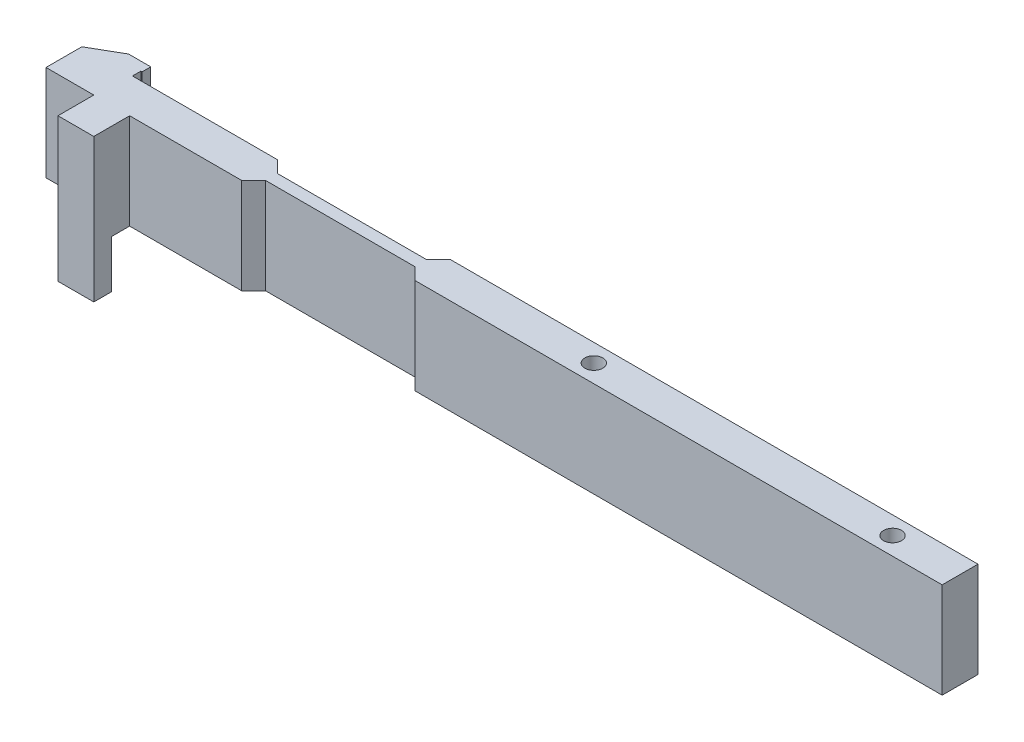
ISO-10303-21;
HEADER;
FILE_DESCRIPTION(('STEP AP214'),'2;1');
FILE_NAME('part.step','',(''),(''),'','','');
FILE_SCHEMA(('AUTOMOTIVE_DESIGN { 1 0 10303 214 1 1 1 1 }'));
ENDSEC;
DATA;
#1=APPLICATION_CONTEXT('core data for automotive mechanical design processes');
#2=APPLICATION_PROTOCOL_DEFINITION('international standard','automotive_design',2000,#1);
#3=PRODUCT_CONTEXT('',#1,'mechanical');
#4=PRODUCT('Part','Part','',(#3));
#5=PRODUCT_RELATED_PRODUCT_CATEGORY('part','',(#4));
#6=PRODUCT_DEFINITION_FORMATION('','',#4);
#7=PRODUCT_DEFINITION_CONTEXT('part definition',#1,'design');
#8=PRODUCT_DEFINITION('design','',#6,#7);
#9=PRODUCT_DEFINITION_SHAPE('','',#8);
#10=(LENGTH_UNIT() NAMED_UNIT(*) SI_UNIT(.MILLI.,.METRE.));
#11=(NAMED_UNIT(*) PLANE_ANGLE_UNIT() SI_UNIT($,.RADIAN.));
#12=(NAMED_UNIT(*) SI_UNIT($,.STERADIAN.) SOLID_ANGLE_UNIT());
#13=UNCERTAINTY_MEASURE_WITH_UNIT(LENGTH_MEASURE(1.E-05),#10,'distance_accuracy_value','');
#14=(GEOMETRIC_REPRESENTATION_CONTEXT(3) GLOBAL_UNCERTAINTY_ASSIGNED_CONTEXT((#13)) GLOBAL_UNIT_ASSIGNED_CONTEXT((#10,
#11,#12)) REPRESENTATION_CONTEXT('',''));
#15=CARTESIAN_POINT('',(0.,0.,0.));
#16=DIRECTION('',(0.,0.,1.));
#17=DIRECTION('',(1.,0.,0.));
#18=AXIS2_PLACEMENT_3D('',#15,#16,#17);
#19=CARTESIAN_POINT('',(-80.,16.,6.));
#20=DIRECTION('',(0.,0.,-1.));
#21=DIRECTION('',(-1.,0.,0.));
#22=AXIS2_PLACEMENT_3D('',#19,#20,#21);
#23=PLANE('',#22);
#24=DIRECTION('',(1.,0.,0.));
#25=VECTOR('',#24,1.);
#26=CARTESIAN_POINT('',(-80.,16.,6.));
#27=LINE('',#26,#25);
#28=CARTESIAN_POINT('',(-66.,16.,6.));
#29=VERTEX_POINT('',#28);
#30=CARTESIAN_POINT('',(-47.2356614630942,16.,6.));
#31=VERTEX_POINT('',#30);
#32=EDGE_CURVE('E53',#29,#31,#27,.T.);
#33=ORIENTED_EDGE('',*,*,#32,.F.);
#34=DIRECTION('',(0.,-1.,0.));
#35=VECTOR('',#34,1.);
#36=CARTESIAN_POINT('',(-66.,24.4852813742386,6.));
#37=LINE('',#36,#35);
#38=CARTESIAN_POINT('',(-66.,0.,6.));
#39=VERTEX_POINT('',#38);
#40=EDGE_CURVE('E232',#29,#39,#37,.T.);
#41=ORIENTED_EDGE('',*,*,#40,.T.);
#42=DIRECTION('',(1.,0.,0.));
#43=VECTOR('',#42,1.);
#44=CARTESIAN_POINT('',(-80.,0.,6.));
#45=LINE('',#44,#43);
#46=CARTESIAN_POINT('',(-47.2356614630942,0.,6.));
#47=VERTEX_POINT('',#46);
#48=EDGE_CURVE('E343',#39,#47,#45,.T.);
#49=ORIENTED_EDGE('',*,*,#48,.T.);
#50=DIRECTION('',(0.,1.,0.));
#51=VECTOR('',#50,1.);
#52=CARTESIAN_POINT('',(-47.2356614630942,16.,6.));
#53=LINE('',#52,#51);
#54=EDGE_CURVE('E299',#47,#31,#53,.T.);
#55=ORIENTED_EDGE('',*,*,#54,.T.);
#56=EDGE_LOOP('',(#33,#41,#49,#55));
#57=FACE_BOUND('',#56,.T.);
#58=ADVANCED_FACE('F38',(#57),#23,.F.);
#59=CARTESIAN_POINT('',(0.,16.,0.));
#60=DIRECTION('',(0.,0.,1.));
#61=DIRECTION('',(1.,0.,0.));
#62=AXIS2_PLACEMENT_3D('',#59,#60,#61);
#63=PLANE('',#62);
#64=DIRECTION('',(-1.,0.,0.));
#65=VECTOR('',#64,1.);
#66=CARTESIAN_POINT('',(0.,0.,0.));
#67=LINE('',#66,#65);
#68=CARTESIAN_POINT('',(70.,0.,0.));
#69=VERTEX_POINT('',#68);
#70=CARTESIAN_POINT('',(-18.2666258583228,0.,0.));
#71=VERTEX_POINT('',#70);
#72=EDGE_CURVE('E324',#69,#71,#67,.T.);
#73=ORIENTED_EDGE('',*,*,#72,.T.);
#74=DIRECTION('',(0.,1.,0.));
#75=VECTOR('',#74,1.);
#76=CARTESIAN_POINT('',(-18.2666258583228,0.,0.));
#77=LINE('',#76,#75);
#78=CARTESIAN_POINT('',(-18.2666258583228,16.,0.));
#79=VERTEX_POINT('',#78);
#80=EDGE_CURVE('E250',#71,#79,#77,.T.);
#81=ORIENTED_EDGE('',*,*,#80,.T.);
#82=DIRECTION('',(-1.,0.,0.));
#83=VECTOR('',#82,1.);
#84=CARTESIAN_POINT('',(70.,16.,0.));
#85=LINE('',#84,#83);
#86=CARTESIAN_POINT('',(70.,16.,0.));
#87=VERTEX_POINT('',#86);
#88=EDGE_CURVE('E302',#87,#79,#85,.T.);
#89=ORIENTED_EDGE('',*,*,#88,.F.);
#90=DIRECTION('',(0.,-1.,0.));
#91=VECTOR('',#90,1.);
#92=CARTESIAN_POINT('',(70.,16.,0.));
#93=LINE('',#92,#91);
#94=EDGE_CURVE('E323',#87,#69,#93,.T.);
#95=ORIENTED_EDGE('',*,*,#94,.T.);
#96=EDGE_LOOP('',(#73,#81,#89,#95));
#97=FACE_BOUND('',#96,.T.);
#98=ADVANCED_FACE('F410',(#97),#63,.F.);
#99=CARTESIAN_POINT('',(-80.,0.,6.));
#100=VERTEX_POINT('',#99);
#101=CARTESIAN_POINT('',(-72.,0.,6.));
#102=VERTEX_POINT('',#101);
#103=EDGE_CURVE('E340',#100,#102,#45,.T.);
#104=ORIENTED_EDGE('',*,*,#103,.T.);
#105=DIRECTION('',(0.,-1.,0.));
#106=VECTOR('',#105,1.);
#107=CARTESIAN_POINT('',(-72.,24.4852813742386,6.));
#108=LINE('',#107,#106);
#109=CARTESIAN_POINT('',(-72.,16.,6.));
#110=VERTEX_POINT('',#109);
#111=EDGE_CURVE('E61',#110,#102,#108,.T.);
#112=ORIENTED_EDGE('',*,*,#111,.F.);
#113=CARTESIAN_POINT('',(-80.,16.,6.));
#114=VERTEX_POINT('',#113);
#115=EDGE_CURVE('E319',#114,#110,#27,.T.);
#116=ORIENTED_EDGE('',*,*,#115,.F.);
#117=DIRECTION('',(0.,-1.,0.));
#118=VECTOR('',#117,1.);
#119=CARTESIAN_POINT('',(-80.,16.,6.));
#120=LINE('',#119,#118);
#121=EDGE_CURVE('E351',#114,#100,#120,.T.);
#122=ORIENTED_EDGE('',*,*,#121,.T.);
#123=EDGE_LOOP('',(#104,#112,#116,#122));
#124=FACE_BOUND('',#123,.T.);
#125=ADVANCED_FACE('F454',(#124),#23,.F.);
#126=CARTESIAN_POINT('',(-47.2431924720825,16.,0.));
#127=VERTEX_POINT('',#126);
#128=CARTESIAN_POINT('',(-71.5259367209433,16.,0.));
#129=VERTEX_POINT('',#128);
#130=EDGE_CURVE('E306',#127,#129,#85,.T.);
#131=ORIENTED_EDGE('',*,*,#130,.F.);
#132=DIRECTION('',(0.,1.,0.));
#133=VECTOR('',#132,1.);
#134=CARTESIAN_POINT('',(-47.2431924720825,0.,0.));
#135=LINE('',#134,#133);
#136=CARTESIAN_POINT('',(-47.2431924720825,0.,0.));
#137=VERTEX_POINT('',#136);
#138=EDGE_CURVE('E264',#137,#127,#135,.T.);
#139=ORIENTED_EDGE('',*,*,#138,.F.);
#140=CARTESIAN_POINT('',(-71.5259367209433,0.,0.));
#141=VERTEX_POINT('',#140);
#142=EDGE_CURVE('E301',#137,#141,#67,.T.);
#143=ORIENTED_EDGE('',*,*,#142,.T.);
#144=DIRECTION('',(0.,-1.,0.));
#145=VECTOR('',#144,1.);
#146=CARTESIAN_POINT('',(-71.5259367209433,16.,0.));
#147=LINE('',#146,#145);
#148=EDGE_CURVE('E46',#129,#141,#147,.T.);
#149=ORIENTED_EDGE('',*,*,#148,.F.);
#150=EDGE_LOOP('',(#131,#139,#143,#149));
#151=FACE_BOUND('',#150,.T.);
#152=ADVANCED_FACE('F40',(#151),#63,.F.);
#153=CARTESIAN_POINT('',(-71.5259367209433,16.,0.));
#154=DIRECTION('',(-1.,0.,0.));
#155=DIRECTION('',(0.,0.,1.));
#156=AXIS2_PLACEMENT_3D('',#153,#154,#155);
#157=PLANE('',#156);
#158=DIRECTION('',(0.,0.,-1.));
#159=VECTOR('',#158,1.);
#160=CARTESIAN_POINT('',(-71.5259367209433,0.,0.));
#161=LINE('',#160,#159);
#162=CARTESIAN_POINT('',(-71.5259367209433,0.,-1.39648023141273));
#163=VERTEX_POINT('',#162);
#164=EDGE_CURVE('E327',#141,#163,#161,.T.);
#165=ORIENTED_EDGE('',*,*,#164,.T.);
#166=DIRECTION('',(0.,-1.,0.));
#167=VECTOR('',#166,1.);
#168=CARTESIAN_POINT('',(-71.5259367209433,16.,-1.39648023141273));
#169=LINE('',#168,#167);
#170=CARTESIAN_POINT('',(-71.5259367209433,16.,-1.39648023141273));
#171=VERTEX_POINT('',#170);
#172=EDGE_CURVE('E366',#171,#163,#169,.T.);
#173=ORIENTED_EDGE('',*,*,#172,.F.);
#174=DIRECTION('',(0.,0.,-1.));
#175=VECTOR('',#174,1.);
#176=CARTESIAN_POINT('',(-71.5259367209433,16.,0.));
#177=LINE('',#176,#175);
#178=EDGE_CURVE('E305',#129,#171,#177,.T.);
#179=ORIENTED_EDGE('',*,*,#178,.F.);
#180=ORIENTED_EDGE('',*,*,#148,.T.);
#181=EDGE_LOOP('',(#165,#173,#179,#180));
#182=FACE_BOUND('',#181,.T.);
#183=ADVANCED_FACE('F373',(#182),#157,.F.);
#184=CARTESIAN_POINT('',(-71.5259367209433,16.,-1.39648023141273));
#185=DIRECTION('',(0.,0.,-1.));
#186=DIRECTION('',(-1.,0.,0.));
#187=AXIS2_PLACEMENT_3D('',#184,#185,#186);
#188=PLANE('',#187);
#189=DIRECTION('',(1.,0.,0.));
#190=VECTOR('',#189,1.);
#191=CARTESIAN_POINT('',(-71.5259367209433,0.,-1.39648023141273));
#192=LINE('',#191,#190);
#193=CARTESIAN_POINT('',(-71.3259367209433,0.,-1.39648023141273));
#194=VERTEX_POINT('',#193);
#195=EDGE_CURVE('E329',#163,#194,#192,.T.);
#196=ORIENTED_EDGE('',*,*,#195,.T.);
#197=DIRECTION('',(0.,-1.,0.));
#198=VECTOR('',#197,1.);
#199=CARTESIAN_POINT('',(-71.3259367209433,16.,-1.39648023141273));
#200=LINE('',#199,#198);
#201=CARTESIAN_POINT('',(-71.3259367209433,16.,-1.39648023141273));
#202=VERTEX_POINT('',#201);
#203=EDGE_CURVE('E363',#202,#194,#200,.T.);
#204=ORIENTED_EDGE('',*,*,#203,.F.);
#205=DIRECTION('',(1.,0.,0.));
#206=VECTOR('',#205,1.);
#207=CARTESIAN_POINT('',(-71.5259367209433,16.,-1.39648023141273));
#208=LINE('',#207,#206);
#209=EDGE_CURVE('E308',#171,#202,#208,.T.);
#210=ORIENTED_EDGE('',*,*,#209,.F.);
#211=ORIENTED_EDGE('',*,*,#172,.T.);
#212=EDGE_LOOP('',(#196,#204,#210,#211));
#213=FACE_BOUND('',#212,.T.);
#214=ADVANCED_FACE('F386',(#213),#188,.F.);
#215=CARTESIAN_POINT('',(-71.3259367209433,16.,-1.39648023141273));
#216=DIRECTION('',(-1.,0.,0.));
#217=DIRECTION('',(0.,0.,1.));
#218=AXIS2_PLACEMENT_3D('',#215,#216,#217);
#219=PLANE('',#218);
#220=DIRECTION('',(0.,0.,-1.));
#221=VECTOR('',#220,1.);
#222=CARTESIAN_POINT('',(-71.3259367209433,0.,-1.39648023141273));
#223=LINE('',#222,#221);
#224=CARTESIAN_POINT('',(-71.3259367209433,0.,-2.85863640033661));
#225=VERTEX_POINT('',#224);
#226=EDGE_CURVE('E331',#194,#225,#223,.T.);
#227=ORIENTED_EDGE('',*,*,#226,.T.);
#228=DIRECTION('',(0.,-1.,0.));
#229=VECTOR('',#228,1.);
#230=CARTESIAN_POINT('',(-71.3259367209433,16.,-2.85863640033661));
#231=LINE('',#230,#229);
#232=CARTESIAN_POINT('',(-71.3259367209433,16.,-2.85863640033661));
#233=VERTEX_POINT('',#232);
#234=EDGE_CURVE('E360',#233,#225,#231,.T.);
#235=ORIENTED_EDGE('',*,*,#234,.F.);
#236=DIRECTION('',(0.,0.,-1.));
#237=VECTOR('',#236,1.);
#238=CARTESIAN_POINT('',(-71.3259367209433,16.,-1.39648023141273));
#239=LINE('',#238,#237);
#240=EDGE_CURVE('E310',#202,#233,#239,.T.);
#241=ORIENTED_EDGE('',*,*,#240,.F.);
#242=ORIENTED_EDGE('',*,*,#203,.T.);
#243=EDGE_LOOP('',(#227,#235,#241,#242));
#244=FACE_BOUND('',#243,.T.);
#245=ADVANCED_FACE('F390',(#244),#219,.F.);
#246=CARTESIAN_POINT('',(-71.3259367209433,16.,-2.85863640033661));
#247=DIRECTION('',(0.,0.,1.));
#248=DIRECTION('',(1.,0.,0.));
#249=AXIS2_PLACEMENT_3D('',#246,#247,#248);
#250=PLANE('',#249);
#251=DIRECTION('',(-1.,0.,0.));
#252=VECTOR('',#251,1.);
#253=CARTESIAN_POINT('',(-71.3259367209433,0.,-2.85863640033661));
#254=LINE('',#253,#252);
#255=CARTESIAN_POINT('',(-75.0356524240512,0.,-2.85863640033661));
#256=VERTEX_POINT('',#255);
#257=EDGE_CURVE('E333',#225,#256,#254,.T.);
#258=ORIENTED_EDGE('',*,*,#257,.T.);
#259=DIRECTION('',(0.,-1.,0.));
#260=VECTOR('',#259,1.);
#261=CARTESIAN_POINT('',(-75.0356524240512,16.,-2.85863640033661));
#262=LINE('',#261,#260);
#263=CARTESIAN_POINT('',(-75.0356524240512,16.,-2.85863640033661));
#264=VERTEX_POINT('',#263);
#265=EDGE_CURVE('E357',#264,#256,#262,.T.);
#266=ORIENTED_EDGE('',*,*,#265,.F.);
#267=DIRECTION('',(-1.,0.,0.));
#268=VECTOR('',#267,1.);
#269=CARTESIAN_POINT('',(-71.3259367209433,16.,-2.85863640033661));
#270=LINE('',#269,#268);
#271=EDGE_CURVE('E312',#233,#264,#270,.T.);
#272=ORIENTED_EDGE('',*,*,#271,.F.);
#273=ORIENTED_EDGE('',*,*,#234,.T.);
#274=EDGE_LOOP('',(#258,#266,#272,#273));
#275=FACE_BOUND('',#274,.T.);
#276=ADVANCED_FACE('F472',(#275),#250,.F.);
#277=CARTESIAN_POINT('',(-75.0356524240512,16.,-2.85863640033661));
#278=DIRECTION('',(0.5,0.,0.866025403784438));
#279=DIRECTION('',(0.866025403784439,0.,-0.5));
#280=AXIS2_PLACEMENT_3D('',#277,#278,#279);
#281=PLANE('',#280);
#282=DIRECTION('',(-0.866025403784438,0.,0.5));
#283=VECTOR('',#282,1.);
#284=CARTESIAN_POINT('',(-75.0356524240512,0.,-2.85863640033661));
#285=LINE('',#284,#283);
#286=CARTESIAN_POINT('',(-80.,0.,0.0075310089883121));
#287=VERTEX_POINT('',#286);
#288=EDGE_CURVE('E335',#256,#287,#285,.T.);
#289=ORIENTED_EDGE('',*,*,#288,.T.);
#290=DIRECTION('',(0.,-1.,0.));
#291=VECTOR('',#290,1.);
#292=CARTESIAN_POINT('',(-80.,16.,0.0075310089883121));
#293=LINE('',#292,#291);
#294=CARTESIAN_POINT('',(-80.,16.,0.0075310089883121));
#295=VERTEX_POINT('',#294);
#296=EDGE_CURVE('E354',#295,#287,#293,.T.);
#297=ORIENTED_EDGE('',*,*,#296,.F.);
#298=DIRECTION('',(-0.866025403784438,0.,0.5));
#299=VECTOR('',#298,1.);
#300=CARTESIAN_POINT('',(-75.0356524240512,16.,-2.85863640033661));
#301=LINE('',#300,#299);
#302=EDGE_CURVE('E314',#264,#295,#301,.T.);
#303=ORIENTED_EDGE('',*,*,#302,.F.);
#304=ORIENTED_EDGE('',*,*,#265,.T.);
#305=EDGE_LOOP('',(#289,#297,#303,#304));
#306=FACE_BOUND('',#305,.T.);
#307=ADVANCED_FACE('F467',(#306),#281,.F.);
#308=CARTESIAN_POINT('',(-80.,16.,0.0075310089883121));
#309=DIRECTION('',(1.,0.,0.));
#310=DIRECTION('',(0.,0.,-1.));
#311=AXIS2_PLACEMENT_3D('',#308,#309,#310);
#312=PLANE('',#311);
#313=DIRECTION('',(0.,0.,1.));
#314=VECTOR('',#313,1.);
#315=CARTESIAN_POINT('',(-80.,0.,0.0075310089883121));
#316=LINE('',#315,#314);
#317=EDGE_CURVE('E337',#287,#100,#316,.T.);
#318=ORIENTED_EDGE('',*,*,#317,.T.);
#319=ORIENTED_EDGE('',*,*,#121,.F.);
#320=DIRECTION('',(0.,0.,1.));
#321=VECTOR('',#320,1.);
#322=CARTESIAN_POINT('',(-80.,16.,0.0075310089883121));
#323=LINE('',#322,#321);
#324=EDGE_CURVE('E316',#295,#114,#323,.T.);
#325=ORIENTED_EDGE('',*,*,#324,.F.);
#326=ORIENTED_EDGE('',*,*,#296,.T.);
#327=EDGE_LOOP('',(#318,#319,#325,#326));
#328=FACE_BOUND('',#327,.T.);
#329=ADVANCED_FACE('F462',(#328),#312,.F.);
#330=CARTESIAN_POINT('',(-18.2741568673111,16.,6.));
#331=VERTEX_POINT('',#330);
#332=CARTESIAN_POINT('',(70.,16.,6.));
#333=VERTEX_POINT('',#332);
#334=EDGE_CURVE('E318',#331,#333,#27,.T.);
#335=ORIENTED_EDGE('',*,*,#334,.F.);
#336=DIRECTION('',(0.,-1.,0.));
#337=VECTOR('',#336,1.);
#338=CARTESIAN_POINT('',(-18.2741568673111,16.,6.));
#339=LINE('',#338,#337);
#340=CARTESIAN_POINT('',(-18.2741568673111,0.,6.));
#341=VERTEX_POINT('',#340);
#342=EDGE_CURVE('E294',#331,#341,#339,.T.);
#343=ORIENTED_EDGE('',*,*,#342,.T.);
#344=CARTESIAN_POINT('',(70.,0.,6.));
#345=VERTEX_POINT('',#344);
#346=EDGE_CURVE('E339',#341,#345,#45,.T.);
#347=ORIENTED_EDGE('',*,*,#346,.T.);
#348=DIRECTION('',(0.,-1.,0.));
#349=VECTOR('',#348,1.);
#350=CARTESIAN_POINT('',(70.,16.,6.));
#351=LINE('',#350,#349);
#352=EDGE_CURVE('E348',#333,#345,#351,.T.);
#353=ORIENTED_EDGE('',*,*,#352,.F.);
#354=EDGE_LOOP('',(#335,#343,#347,#353));
#355=FACE_BOUND('',#354,.T.);
#356=ADVANCED_FACE('F435',(#355),#23,.F.);
#357=CARTESIAN_POINT('',(70.,16.,6.));
#358=DIRECTION('',(-1.,0.,0.));
#359=DIRECTION('',(0.,0.,1.));
#360=AXIS2_PLACEMENT_3D('',#357,#358,#359);
#361=PLANE('',#360);
#362=DIRECTION('',(0.,0.,-1.));
#363=VECTOR('',#362,1.);
#364=CARTESIAN_POINT('',(70.,0.,6.));
#365=LINE('',#364,#363);
#366=EDGE_CURVE('E342',#345,#69,#365,.T.);
#367=ORIENTED_EDGE('',*,*,#366,.T.);
#368=ORIENTED_EDGE('',*,*,#94,.F.);
#369=DIRECTION('',(0.,0.,-1.));
#370=VECTOR('',#369,1.);
#371=CARTESIAN_POINT('',(70.,16.,6.));
#372=LINE('',#371,#370);
#373=EDGE_CURVE('E321',#333,#87,#372,.T.);
#374=ORIENTED_EDGE('',*,*,#373,.F.);
#375=ORIENTED_EDGE('',*,*,#352,.T.);
#376=EDGE_LOOP('',(#367,#368,#374,#375));
#377=FACE_BOUND('',#376,.T.);
#378=ADVANCED_FACE('F417',(#377),#361,.F.);
#379=CARTESIAN_POINT('',(0.,16.,0.));
#380=DIRECTION('',(0.,-1.,0.));
#381=DIRECTION('',(0.,0.,-1.));
#382=AXIS2_PLACEMENT_3D('',#379,#380,#381);
#383=PLANE('',#382);
#384=CARTESIAN_POINT('',(58.6991032148639,16.,3.00376550449415));
#385=DIRECTION('',(0.,1.,0.));
#386=DIRECTION('',(0.,0.,1.));
#387=AXIS2_PLACEMENT_3D('',#384,#385,#386);
#388=CIRCLE('',#387,1.5);
#389=CARTESIAN_POINT('',(58.6991032148639,16.,4.50376550449415));
#390=VERTEX_POINT('',#389);
#391=EDGE_CURVE('E239',#390,#390,#388,.T.);
#392=ORIENTED_EDGE('',*,*,#391,.F.);
#393=EDGE_LOOP('',(#392));
#394=FACE_BOUND('',#393,.T.);
#395=CARTESIAN_POINT('',(8.69910321486389,16.,3.00376550449415));
#396=DIRECTION('',(0.,1.,0.));
#397=DIRECTION('',(0.,0.,1.));
#398=AXIS2_PLACEMENT_3D('',#395,#396,#397);
#399=CIRCLE('',#398,1.5);
#400=CARTESIAN_POINT('',(8.69910321486389,16.,4.50376550449416));
#401=VERTEX_POINT('',#400);
#402=EDGE_CURVE('E261',#401,#401,#399,.T.);
#403=ORIENTED_EDGE('',*,*,#402,.F.);
#404=EDGE_LOOP('',(#403));
#405=FACE_BOUND('',#404,.T.);
#406=ORIENTED_EDGE('',*,*,#115,.T.);
#407=DIRECTION('',(0.,0.,1.));
#408=VECTOR('',#407,1.);
#409=CARTESIAN_POINT('',(-72.,16.,12.));
#410=LINE('',#409,#408);
#411=CARTESIAN_POINT('',(-72.,16.,12.));
#412=VERTEX_POINT('',#411);
#413=EDGE_CURVE('E229',#110,#412,#410,.T.);
#414=ORIENTED_EDGE('',*,*,#413,.T.);
#415=DIRECTION('',(1.,0.,0.));
#416=VECTOR('',#415,1.);
#417=CARTESIAN_POINT('',(-72.,16.,12.));
#418=LINE('',#417,#416);
#419=CARTESIAN_POINT('',(-66.,16.,12.));
#420=VERTEX_POINT('',#419);
#421=EDGE_CURVE('E199',#412,#420,#418,.T.);
#422=ORIENTED_EDGE('',*,*,#421,.T.);
#423=DIRECTION('',(0.,0.,-1.));
#424=VECTOR('',#423,1.);
#425=CARTESIAN_POINT('',(-66.,16.,12.));
#426=LINE('',#425,#424);
#427=EDGE_CURVE('E231',#420,#29,#426,.T.);
#428=ORIENTED_EDGE('',*,*,#427,.T.);
#429=ORIENTED_EDGE('',*,*,#32,.T.);
#430=DIRECTION('',(-0.707106781186558,0.,0.707106781186537));
#431=VECTOR('',#430,1.);
#432=CARTESIAN_POINT('',(-47.2431924720825,16.,6.00753100898831));
#433=LINE('',#432,#431);
#434=CARTESIAN_POINT('',(-45.2394269675883,16.,4.00376550449416));
#435=VERTEX_POINT('',#434);
#436=EDGE_CURVE('E276',#435,#31,#433,.T.);
#437=ORIENTED_EDGE('',*,*,#436,.F.);
#438=DIRECTION('',(-1.,0.,0.));
#439=VECTOR('',#438,1.);
#440=CARTESIAN_POINT('',(-45.2394269675883,16.,4.00376550449416));
#441=LINE('',#440,#439);
#442=CARTESIAN_POINT('',(-20.270391362817,16.,4.00376550449416));
#443=VERTEX_POINT('',#442);
#444=EDGE_CURVE('E272',#443,#435,#441,.T.);
#445=ORIENTED_EDGE('',*,*,#444,.F.);
#446=DIRECTION('',(-0.707106781186558,0.,-0.707106781186537));
#447=VECTOR('',#446,1.);
#448=CARTESIAN_POINT('',(-20.270391362817,16.,4.00376550449416));
#449=LINE('',#448,#447);
#450=EDGE_CURVE('E279',#331,#443,#449,.T.);
#451=ORIENTED_EDGE('',*,*,#450,.F.);
#452=ORIENTED_EDGE('',*,*,#334,.T.);
#453=ORIENTED_EDGE('',*,*,#373,.T.);
#454=ORIENTED_EDGE('',*,*,#88,.T.);
#455=DIRECTION('',(0.707106781186558,0.,-0.707106781186537));
#456=VECTOR('',#455,1.);
#457=CARTESIAN_POINT('',(-20.270391362817,16.,2.00376550449415));
#458=LINE('',#457,#456);
#459=CARTESIAN_POINT('',(-20.270391362817,16.,2.00376550449415));
#460=VERTEX_POINT('',#459);
#461=EDGE_CURVE('E251',#460,#79,#458,.T.);
#462=ORIENTED_EDGE('',*,*,#461,.F.);
#463=DIRECTION('',(1.,0.,0.));
#464=VECTOR('',#463,1.);
#465=CARTESIAN_POINT('',(-45.2394269675883,16.,2.00376550449415));
#466=LINE('',#465,#464);
#467=CARTESIAN_POINT('',(-45.2394269675883,16.,2.00376550449415));
#468=VERTEX_POINT('',#467);
#469=EDGE_CURVE('E244',#468,#460,#466,.T.);
#470=ORIENTED_EDGE('',*,*,#469,.F.);
#471=DIRECTION('',(0.707106781186558,0.,0.707106781186537));
#472=VECTOR('',#471,1.);
#473=CARTESIAN_POINT('',(-47.2431924720825,16.,0.));
#474=LINE('',#473,#472);
#475=EDGE_CURVE('E253',#127,#468,#474,.T.);
#476=ORIENTED_EDGE('',*,*,#475,.F.);
#477=ORIENTED_EDGE('',*,*,#130,.T.);
#478=ORIENTED_EDGE('',*,*,#178,.T.);
#479=ORIENTED_EDGE('',*,*,#209,.T.);
#480=ORIENTED_EDGE('',*,*,#240,.T.);
#481=ORIENTED_EDGE('',*,*,#271,.T.);
#482=ORIENTED_EDGE('',*,*,#302,.T.);
#483=ORIENTED_EDGE('',*,*,#324,.T.);
#484=EDGE_LOOP('',(#406,#414,#422,#428,#429,#437,#445,#451,#452,#453,#454,#462,#470,#476,#477,
#478,#479,#480,#481,#482,#483));
#485=FACE_BOUND('',#484,.T.);
#486=ADVANCED_FACE('F394',(#394,#405,#485),#383,.F.);
#487=CARTESIAN_POINT('',(0.,0.,0.));
#488=DIRECTION('',(0.,-1.,0.));
#489=DIRECTION('',(0.,0.,-1.));
#490=AXIS2_PLACEMENT_3D('',#487,#488,#489);
#491=PLANE('',#490);
#492=DIRECTION('',(0.894427190999916,0.,0.447213595499958));
#493=VECTOR('',#492,1.);
#494=CARTESIAN_POINT('',(-16.8,0.,33.6));
#495=LINE('',#494,#493);
#496=CARTESIAN_POINT('',(-66.,0.,9.));
#497=VERTEX_POINT('',#496);
#498=EDGE_CURVE('E217',#102,#497,#495,.T.);
#499=ORIENTED_EDGE('',*,*,#498,.F.);
#500=ORIENTED_EDGE('',*,*,#103,.F.);
#501=ORIENTED_EDGE('',*,*,#317,.F.);
#502=ORIENTED_EDGE('',*,*,#288,.F.);
#503=ORIENTED_EDGE('',*,*,#257,.F.);
#504=ORIENTED_EDGE('',*,*,#226,.F.);
#505=ORIENTED_EDGE('',*,*,#195,.F.);
#506=ORIENTED_EDGE('',*,*,#164,.F.);
#507=ORIENTED_EDGE('',*,*,#142,.F.);
#508=DIRECTION('',(0.707106781186558,0.,0.707106781186537));
#509=VECTOR('',#508,1.);
#510=CARTESIAN_POINT('',(-47.2431924720825,0.,0.));
#511=LINE('',#510,#509);
#512=CARTESIAN_POINT('',(-45.2394269675883,0.,2.00376550449415));
#513=VERTEX_POINT('',#512);
#514=EDGE_CURVE('E243',#137,#513,#511,.T.);
#515=ORIENTED_EDGE('',*,*,#514,.T.);
#516=DIRECTION('',(1.,0.,0.));
#517=VECTOR('',#516,1.);
#518=CARTESIAN_POINT('',(-45.2394269675883,0.,2.00376550449415));
#519=LINE('',#518,#517);
#520=CARTESIAN_POINT('',(-20.270391362817,0.,2.00376550449415));
#521=VERTEX_POINT('',#520);
#522=EDGE_CURVE('E247',#513,#521,#519,.T.);
#523=ORIENTED_EDGE('',*,*,#522,.T.);
#524=DIRECTION('',(0.707106781186558,0.,-0.707106781186537));
#525=VECTOR('',#524,1.);
#526=CARTESIAN_POINT('',(-20.270391362817,0.,2.00376550449415));
#527=LINE('',#526,#525);
#528=EDGE_CURVE('E240',#521,#71,#527,.T.);
#529=ORIENTED_EDGE('',*,*,#528,.T.);
#530=ORIENTED_EDGE('',*,*,#72,.F.);
#531=ORIENTED_EDGE('',*,*,#366,.F.);
#532=ORIENTED_EDGE('',*,*,#346,.F.);
#533=DIRECTION('',(0.707106781186558,0.,0.707106781186537));
#534=VECTOR('',#533,1.);
#535=CARTESIAN_POINT('',(-12.1370784336553,0.,12.1370784336556));
#536=LINE('',#535,#534);
#537=CARTESIAN_POINT('',(-20.270391362817,0.,4.00376550449416));
#538=VERTEX_POINT('',#537);
#539=EDGE_CURVE('E11',#538,#341,#536,.T.);
#540=ORIENTED_EDGE('',*,*,#539,.F.);
#541=DIRECTION('',(-1.,0.,0.));
#542=VECTOR('',#541,1.);
#543=CARTESIAN_POINT('',(-45.2394269675883,0.,4.00376550449416));
#544=LINE('',#543,#542);
#545=CARTESIAN_POINT('',(-45.2394269675883,0.,4.00376550449416));
#546=VERTEX_POINT('',#545);
#547=EDGE_CURVE('E271',#538,#546,#544,.T.);
#548=ORIENTED_EDGE('',*,*,#547,.T.);
#549=DIRECTION('',(-0.707106781186558,0.,0.707106781186537));
#550=VECTOR('',#549,1.);
#551=CARTESIAN_POINT('',(-47.2431924720825,0.,6.00753100898831));
#552=LINE('',#551,#550);
#553=EDGE_CURVE('E268',#546,#47,#552,.T.);
#554=ORIENTED_EDGE('',*,*,#553,.T.);
#555=ORIENTED_EDGE('',*,*,#48,.F.);
#556=DIRECTION('',(0.,0.,1.));
#557=VECTOR('',#556,1.);
#558=CARTESIAN_POINT('',(-66.,0.,12.));
#559=LINE('',#558,#557);
#560=EDGE_CURVE('E228',#39,#497,#559,.T.);
#561=ORIENTED_EDGE('',*,*,#560,.T.);
#562=EDGE_LOOP('',(#499,#500,#501,#502,#503,#504,#505,#506,#507,#515,#523,#529,#530,#531,#532,
#540,#548,#554,#555,#561));
#563=FACE_BOUND('',#562,.T.);
#564=CARTESIAN_POINT('',(58.6991032148639,0.,3.00376550449415));
#565=DIRECTION('',(0.,1.,0.));
#566=DIRECTION('',(0.,0.,1.));
#567=AXIS2_PLACEMENT_3D('',#564,#565,#566);
#568=CIRCLE('',#567,1.5);
#569=CARTESIAN_POINT('',(58.6991032148639,0.,4.50376550449415));
#570=VERTEX_POINT('',#569);
#571=EDGE_CURVE('E280',#570,#570,#568,.T.);
#572=ORIENTED_EDGE('',*,*,#571,.T.);
#573=EDGE_LOOP('',(#572));
#574=FACE_BOUND('',#573,.T.);
#575=CARTESIAN_POINT('',(8.69910321486389,0.,3.00376550449415));
#576=DIRECTION('',(0.,1.,0.));
#577=DIRECTION('',(0.,0.,1.));
#578=AXIS2_PLACEMENT_3D('',#575,#576,#577);
#579=CIRCLE('',#578,1.5);
#580=CARTESIAN_POINT('',(8.69910321486389,0.,4.50376550449416));
#581=VERTEX_POINT('',#580);
#582=EDGE_CURVE('E291',#581,#581,#579,.T.);
#583=ORIENTED_EDGE('',*,*,#582,.T.);
#584=EDGE_LOOP('',(#583));
#585=FACE_BOUND('',#584,.T.);
#586=ADVANCED_FACE('F380',(#563,#574,#585),#491,.T.);
#587=CARTESIAN_POINT('',(8.69910321486389,0.,3.00376550449415));
#588=DIRECTION('',(0.,1.,0.));
#589=DIRECTION('',(0.,0.,1.));
#590=AXIS2_PLACEMENT_3D('',#587,#588,#589);
#591=CYLINDRICAL_SURFACE('',#590,1.5);
#592=ORIENTED_EDGE('',*,*,#582,.F.);
#593=EDGE_LOOP('',(#592));
#594=FACE_BOUND('',#593,.T.);
#595=ORIENTED_EDGE('',*,*,#402,.T.);
#596=EDGE_LOOP('',(#595));
#597=FACE_BOUND('',#596,.T.);
#598=ADVANCED_FACE('F554',(#594,#597),#591,.F.);
#599=CARTESIAN_POINT('',(-20.270391362817,0.,2.00376550449415));
#600=DIRECTION('',(0.707106781186537,0.,0.707106781186558));
#601=DIRECTION('',(0.707106781186558,0.,-0.707106781186537));
#602=AXIS2_PLACEMENT_3D('',#599,#600,#601);
#603=PLANE('',#602);
#604=ORIENTED_EDGE('',*,*,#461,.T.);
#605=ORIENTED_EDGE('',*,*,#80,.F.);
#606=ORIENTED_EDGE('',*,*,#528,.F.);
#607=DIRECTION('',(0.,1.,0.));
#608=VECTOR('',#607,1.);
#609=CARTESIAN_POINT('',(-20.270391362817,0.,2.00376550449415));
#610=LINE('',#609,#608);
#611=EDGE_CURVE('E259',#521,#460,#610,.T.);
#612=ORIENTED_EDGE('',*,*,#611,.T.);
#613=EDGE_LOOP('',(#604,#605,#606,#612));
#614=FACE_BOUND('',#613,.T.);
#615=ADVANCED_FACE('F407',(#614),#603,.F.);
#616=CARTESIAN_POINT('',(-45.2394269675883,0.,2.00376550449415));
#617=DIRECTION('',(0.,0.,1.));
#618=DIRECTION('',(1.,0.,0.));
#619=AXIS2_PLACEMENT_3D('',#616,#617,#618);
#620=PLANE('',#619);
#621=ORIENTED_EDGE('',*,*,#469,.T.);
#622=ORIENTED_EDGE('',*,*,#611,.F.);
#623=ORIENTED_EDGE('',*,*,#522,.F.);
#624=DIRECTION('',(0.,1.,0.));
#625=VECTOR('',#624,1.);
#626=CARTESIAN_POINT('',(-45.2394269675883,0.,2.00376550449415));
#627=LINE('',#626,#625);
#628=EDGE_CURVE('E262',#513,#468,#627,.T.);
#629=ORIENTED_EDGE('',*,*,#628,.T.);
#630=EDGE_LOOP('',(#621,#622,#623,#629));
#631=FACE_BOUND('',#630,.T.);
#632=ADVANCED_FACE('F404',(#631),#620,.F.);
#633=CARTESIAN_POINT('',(-47.2431924720825,0.,0.));
#634=DIRECTION('',(-0.707106781186537,0.,0.707106781186558));
#635=DIRECTION('',(0.707106781186558,0.,0.707106781186537));
#636=AXIS2_PLACEMENT_3D('',#633,#634,#635);
#637=PLANE('',#636);
#638=ORIENTED_EDGE('',*,*,#475,.T.);
#639=ORIENTED_EDGE('',*,*,#628,.F.);
#640=ORIENTED_EDGE('',*,*,#514,.F.);
#641=ORIENTED_EDGE('',*,*,#138,.T.);
#642=EDGE_LOOP('',(#638,#639,#640,#641));
#643=FACE_BOUND('',#642,.T.);
#644=ADVANCED_FACE('F400',(#643),#637,.F.);
#645=CARTESIAN_POINT('',(-47.2431924720825,0.,6.00753100898831));
#646=DIRECTION('',(-0.707106781186537,0.,-0.707106781186558));
#647=DIRECTION('',(-0.707106781186558,0.,0.707106781186537));
#648=AXIS2_PLACEMENT_3D('',#645,#646,#647);
#649=PLANE('',#648);
#650=ORIENTED_EDGE('',*,*,#553,.F.);
#651=DIRECTION('',(0.,1.,0.));
#652=VECTOR('',#651,1.);
#653=CARTESIAN_POINT('',(-45.2394269675883,0.,4.00376550449416));
#654=LINE('',#653,#652);
#655=EDGE_CURVE('E254',#546,#435,#654,.T.);
#656=ORIENTED_EDGE('',*,*,#655,.T.);
#657=ORIENTED_EDGE('',*,*,#436,.T.);
#658=ORIENTED_EDGE('',*,*,#54,.F.);
#659=EDGE_LOOP('',(#650,#656,#657,#658));
#660=FACE_BOUND('',#659,.T.);
#661=ADVANCED_FACE('F427',(#660),#649,.F.);
#662=CARTESIAN_POINT('',(-20.270391362817,0.,4.00376550449416));
#663=DIRECTION('',(0.707106781186537,0.,-0.707106781186558));
#664=DIRECTION('',(-0.707106781186558,0.,-0.707106781186537));
#665=AXIS2_PLACEMENT_3D('',#662,#663,#664);
#666=PLANE('',#665);
#667=ORIENTED_EDGE('',*,*,#450,.T.);
#668=DIRECTION('',(0.,1.,0.));
#669=VECTOR('',#668,1.);
#670=CARTESIAN_POINT('',(-20.270391362817,0.,4.00376550449416));
#671=LINE('',#670,#669);
#672=EDGE_CURVE('E275',#538,#443,#671,.T.);
#673=ORIENTED_EDGE('',*,*,#672,.F.);
#674=ORIENTED_EDGE('',*,*,#539,.T.);
#675=ORIENTED_EDGE('',*,*,#342,.F.);
#676=EDGE_LOOP('',(#667,#673,#674,#675));
#677=FACE_BOUND('',#676,.T.);
#678=ADVANCED_FACE('F434',(#677),#666,.F.);
#679=CARTESIAN_POINT('',(-45.2394269675883,0.,4.00376550449416));
#680=DIRECTION('',(0.,0.,-1.));
#681=DIRECTION('',(-1.,0.,0.));
#682=AXIS2_PLACEMENT_3D('',#679,#680,#681);
#683=PLANE('',#682);
#684=ORIENTED_EDGE('',*,*,#444,.T.);
#685=ORIENTED_EDGE('',*,*,#655,.F.);
#686=ORIENTED_EDGE('',*,*,#547,.F.);
#687=ORIENTED_EDGE('',*,*,#672,.T.);
#688=EDGE_LOOP('',(#684,#685,#686,#687));
#689=FACE_BOUND('',#688,.T.);
#690=ADVANCED_FACE('F431',(#689),#683,.F.);
#691=CARTESIAN_POINT('',(58.6991032148639,0.,3.00376550449415));
#692=DIRECTION('',(0.,1.,0.));
#693=DIRECTION('',(0.,0.,1.));
#694=AXIS2_PLACEMENT_3D('',#691,#692,#693);
#695=CYLINDRICAL_SURFACE('',#694,1.5);
#696=ORIENTED_EDGE('',*,*,#571,.F.);
#697=EDGE_LOOP('',(#696));
#698=FACE_BOUND('',#697,.T.);
#699=ORIENTED_EDGE('',*,*,#391,.T.);
#700=EDGE_LOOP('',(#699));
#701=FACE_BOUND('',#700,.T.);
#702=ADVANCED_FACE('F608',(#698,#701),#695,.F.);
#703=CARTESIAN_POINT('',(-66.,24.4852813742386,12.));
#704=DIRECTION('',(1.,0.,0.));
#705=DIRECTION('',(0.,0.,-1.));
#706=AXIS2_PLACEMENT_3D('',#703,#704,#705);
#707=PLANE('',#706);
#708=ORIENTED_EDGE('',*,*,#427,.F.);
#709=DIRECTION('',(0.,-1.,0.));
#710=VECTOR('',#709,1.);
#711=CARTESIAN_POINT('',(-66.,24.4852813742386,12.));
#712=LINE('',#711,#710);
#713=CARTESIAN_POINT('',(-66.,-8.,12.));
#714=VERTEX_POINT('',#713);
#715=EDGE_CURVE('E202',#420,#714,#712,.T.);
#716=ORIENTED_EDGE('',*,*,#715,.T.);
#717=DIRECTION('',(0.,0.,1.));
#718=VECTOR('',#717,1.);
#719=CARTESIAN_POINT('',(-66.,-8.,0.));
#720=LINE('',#719,#718);
#721=CARTESIAN_POINT('',(-66.,-8.,9.));
#722=VERTEX_POINT('',#721);
#723=EDGE_CURVE('E216',#722,#714,#720,.T.);
#724=ORIENTED_EDGE('',*,*,#723,.F.);
#725=DIRECTION('',(0.,1.,0.));
#726=VECTOR('',#725,1.);
#727=CARTESIAN_POINT('',(-66.,-8.,9.));
#728=LINE('',#727,#726);
#729=EDGE_CURVE('E223',#722,#497,#728,.T.);
#730=ORIENTED_EDGE('',*,*,#729,.T.);
#731=ORIENTED_EDGE('',*,*,#560,.F.);
#732=ORIENTED_EDGE('',*,*,#40,.F.);
#733=EDGE_LOOP('',(#708,#716,#724,#730,#731,#732));
#734=FACE_BOUND('',#733,.T.);
#735=ADVANCED_FACE('F438',(#734),#707,.T.);
#736=CARTESIAN_POINT('',(-72.,24.4852813742386,12.));
#737=DIRECTION('',(-1.,0.,0.));
#738=DIRECTION('',(0.,0.,1.));
#739=AXIS2_PLACEMENT_3D('',#736,#737,#738);
#740=PLANE('',#739);
#741=ORIENTED_EDGE('',*,*,#413,.F.);
#742=ORIENTED_EDGE('',*,*,#111,.T.);
#743=DIRECTION('',(0.,1.,0.));
#744=VECTOR('',#743,1.);
#745=CARTESIAN_POINT('',(-72.,-8.,5.99999999999999));
#746=LINE('',#745,#744);
#747=CARTESIAN_POINT('',(-72.,-8.,5.99999999999999));
#748=VERTEX_POINT('',#747);
#749=EDGE_CURVE('E208',#748,#102,#746,.T.);
#750=ORIENTED_EDGE('',*,*,#749,.F.);
#751=DIRECTION('',(0.,0.,-1.));
#752=VECTOR('',#751,1.);
#753=CARTESIAN_POINT('',(-72.,-8.,0.));
#754=LINE('',#753,#752);
#755=CARTESIAN_POINT('',(-72.,-8.,12.));
#756=VERTEX_POINT('',#755);
#757=EDGE_CURVE('E205',#756,#748,#754,.T.);
#758=ORIENTED_EDGE('',*,*,#757,.F.);
#759=DIRECTION('',(0.,-1.,0.));
#760=VECTOR('',#759,1.);
#761=CARTESIAN_POINT('',(-72.,24.4852813742386,12.));
#762=LINE('',#761,#760);
#763=EDGE_CURVE('E193',#412,#756,#762,.T.);
#764=ORIENTED_EDGE('',*,*,#763,.F.);
#765=EDGE_LOOP('',(#741,#742,#750,#758,#764));
#766=FACE_BOUND('',#765,.T.);
#767=ADVANCED_FACE('F206',(#766),#740,.T.);
#768=CARTESIAN_POINT('',(-72.,24.4852813742386,12.));
#769=DIRECTION('',(0.,0.,1.));
#770=DIRECTION('',(1.,0.,0.));
#771=AXIS2_PLACEMENT_3D('',#768,#769,#770);
#772=PLANE('',#771);
#773=ORIENTED_EDGE('',*,*,#421,.F.);
#774=ORIENTED_EDGE('',*,*,#763,.T.);
#775=DIRECTION('',(-1.,0.,0.));
#776=VECTOR('',#775,1.);
#777=CARTESIAN_POINT('',(0.,-8.,12.));
#778=LINE('',#777,#776);
#779=EDGE_CURVE('E198',#714,#756,#778,.T.);
#780=ORIENTED_EDGE('',*,*,#779,.F.);
#781=ORIENTED_EDGE('',*,*,#715,.F.);
#782=EDGE_LOOP('',(#773,#774,#780,#781));
#783=FACE_BOUND('',#782,.T.);
#784=ADVANCED_FACE('F195',(#783),#772,.T.);
#785=CARTESIAN_POINT('',(-16.8,-8.,33.6));
#786=DIRECTION('',(-0.447213595499958,0.,0.894427190999916));
#787=DIRECTION('',(0.894427190999916,0.,0.447213595499958));
#788=AXIS2_PLACEMENT_3D('',#785,#786,#787);
#789=PLANE('',#788);
#790=ORIENTED_EDGE('',*,*,#498,.T.);
#791=ORIENTED_EDGE('',*,*,#729,.F.);
#792=DIRECTION('',(0.894427190999916,0.,0.447213595499958));
#793=VECTOR('',#792,1.);
#794=CARTESIAN_POINT('',(-16.8,-8.,33.6));
#795=LINE('',#794,#793);
#796=EDGE_CURVE('E211',#748,#722,#795,.T.);
#797=ORIENTED_EDGE('',*,*,#796,.F.);
#798=ORIENTED_EDGE('',*,*,#749,.T.);
#799=EDGE_LOOP('',(#790,#791,#797,#798));
#800=FACE_BOUND('',#799,.T.);
#801=ADVANCED_FACE('F442',(#800),#789,.F.);
#802=CARTESIAN_POINT('',(0.,-8.,0.));
#803=DIRECTION('',(0.,-1.,0.));
#804=DIRECTION('',(0.,0.,-1.));
#805=AXIS2_PLACEMENT_3D('',#802,#803,#804);
#806=PLANE('',#805);
#807=ORIENTED_EDGE('',*,*,#779,.T.);
#808=ORIENTED_EDGE('',*,*,#757,.T.);
#809=ORIENTED_EDGE('',*,*,#796,.T.);
#810=ORIENTED_EDGE('',*,*,#723,.T.);
#811=EDGE_LOOP('',(#807,#808,#809,#810));
#812=FACE_BOUND('',#811,.T.);
#813=ADVANCED_FACE('F214',(#812),#806,.T.);
#814=CLOSED_SHELL('',(#58,#98,#125,#152,#183,#214,#245,#276,#307,#329,#356,#378,#486,#586,#598,
#615,#632,#644,#661,#678,#690,#702,#735,#767,#784,#801,#813));
#815=MANIFOLD_SOLID_BREP('B2',#814);
#816=ADVANCED_BREP_SHAPE_REPRESENTATION('',(#18,#815),#14);
#817=SHAPE_DEFINITION_REPRESENTATION(#9,#816);
ENDSEC;
END-ISO-10303-21;
